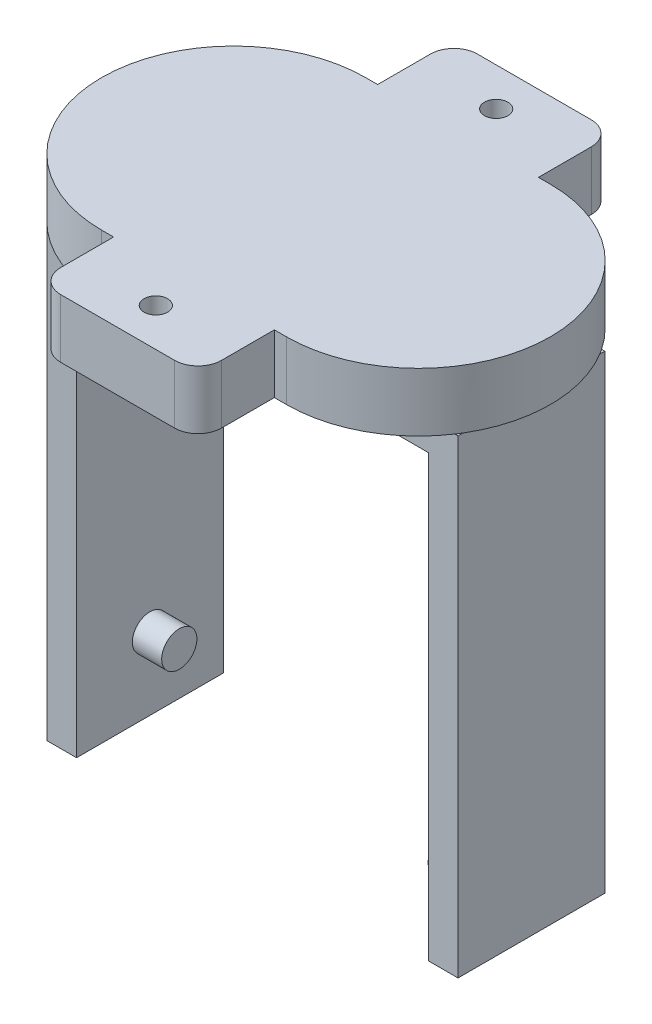
ISO-10303-21;
HEADER;
FILE_DESCRIPTION(('STEP AP214'),'2;1');
FILE_NAME('part.step','',(''),(''),'','','');
FILE_SCHEMA(('AUTOMOTIVE_DESIGN { 1 0 10303 214 1 1 1 1 }'));
ENDSEC;
DATA;
#1=APPLICATION_CONTEXT('core data for automotive mechanical design processes');
#2=APPLICATION_PROTOCOL_DEFINITION('international standard','automotive_design',2000,#1);
#3=PRODUCT_CONTEXT('',#1,'mechanical');
#4=PRODUCT('Part','Part','',(#3));
#5=PRODUCT_RELATED_PRODUCT_CATEGORY('part','',(#4));
#6=PRODUCT_DEFINITION_FORMATION('','',#4);
#7=PRODUCT_DEFINITION_CONTEXT('part definition',#1,'design');
#8=PRODUCT_DEFINITION('design','',#6,#7);
#9=PRODUCT_DEFINITION_SHAPE('','',#8);
#10=(LENGTH_UNIT() NAMED_UNIT(*) SI_UNIT(.MILLI.,.METRE.));
#11=(NAMED_UNIT(*) PLANE_ANGLE_UNIT() SI_UNIT($,.RADIAN.));
#12=(NAMED_UNIT(*) SI_UNIT($,.STERADIAN.) SOLID_ANGLE_UNIT());
#13=UNCERTAINTY_MEASURE_WITH_UNIT(LENGTH_MEASURE(1.E-05),#10,'distance_accuracy_value','');
#14=(GEOMETRIC_REPRESENTATION_CONTEXT(3) GLOBAL_UNCERTAINTY_ASSIGNED_CONTEXT((#13)) GLOBAL_UNIT_ASSIGNED_CONTEXT((#10,
#11,#12)) REPRESENTATION_CONTEXT('',''));
#15=CARTESIAN_POINT('',(0.,0.,0.));
#16=DIRECTION('',(0.,0.,1.));
#17=DIRECTION('',(1.,0.,0.));
#18=AXIS2_PLACEMENT_3D('',#15,#16,#17);
#19=CARTESIAN_POINT('',(5.,21.2431693989071,12.431693989071));
#20=DIRECTION('',(0.,-1.,0.));
#21=DIRECTION('',(0.,0.,-1.));
#22=AXIS2_PLACEMENT_3D('',#19,#20,#21);
#23=PLANE('',#22);
#24=CARTESIAN_POINT('',(19.25,21.2431693989071,-0.068306010928991));
#25=DIRECTION('',(0.,1.,0.));
#26=DIRECTION('',(0.,0.,1.));
#27=AXIS2_PLACEMENT_3D('',#24,#25,#26);
#28=CIRCLE('',#27,22.5);
#29=CARTESIAN_POINT('',(0.541713066130295,21.2431693989071,-12.568306010929));
#30=VERTEX_POINT('',#29);
#31=CARTESIAN_POINT('',(0.,21.2431693989071,-11.7168037681507));
#32=VERTEX_POINT('',#31);
#33=EDGE_CURVE('E11',#30,#32,#28,.T.);
#34=ORIENTED_EDGE('',*,*,#33,.F.);
#35=DIRECTION('',(-1.,0.,0.));
#36=VECTOR('',#35,1.);
#37=CARTESIAN_POINT('',(5.,21.2431693989071,-12.568306010929));
#38=LINE('',#37,#36);
#39=CARTESIAN_POINT('',(0.,21.2431693989071,-12.568306010929));
#40=VERTEX_POINT('',#39);
#41=EDGE_CURVE('E525',#30,#40,#38,.T.);
#42=ORIENTED_EDGE('',*,*,#41,.T.);
#43=DIRECTION('',(0.,0.,1.));
#44=VECTOR('',#43,1.);
#45=CARTESIAN_POINT('',(0.,21.2431693989071,12.431693989071));
#46=LINE('',#45,#44);
#47=EDGE_CURVE('E500',#40,#32,#46,.T.);
#48=ORIENTED_EDGE('',*,*,#47,.T.);
#49=EDGE_LOOP('',(#34,#42,#48));
#50=FACE_BOUND('',#49,.T.);
#51=ADVANCED_FACE('F43',(#50),#23,.F.);
#52=CARTESIAN_POINT('',(0.,21.2431693989071,11.5801917462927));
#53=VERTEX_POINT('',#52);
#54=CARTESIAN_POINT('',(0.541713066130302,21.2431693989071,12.431693989071));
#55=VERTEX_POINT('',#54);
#56=EDGE_CURVE('E53',#53,#55,#28,.T.);
#57=ORIENTED_EDGE('',*,*,#56,.F.);
#58=CARTESIAN_POINT('',(0.,21.2431693989071,12.431693989071));
#59=VERTEX_POINT('',#58);
#60=EDGE_CURVE('E517',#53,#59,#46,.T.);
#61=ORIENTED_EDGE('',*,*,#60,.T.);
#62=DIRECTION('',(-1.,0.,0.));
#63=VECTOR('',#62,1.);
#64=CARTESIAN_POINT('',(5.,21.2431693989071,12.431693989071));
#65=LINE('',#64,#63);
#66=EDGE_CURVE('E506',#55,#59,#65,.T.);
#67=ORIENTED_EDGE('',*,*,#66,.F.);
#68=EDGE_LOOP('',(#57,#61,#67));
#69=FACE_BOUND('',#68,.T.);
#70=ADVANCED_FACE('F596',(#69),#23,.F.);
#71=CARTESIAN_POINT('',(50.75,21.2431693989071,-0.068306010928991));
#72=DIRECTION('',(0.,1.,0.));
#73=DIRECTION('',(0.,0.,1.));
#74=AXIS2_PLACEMENT_3D('',#71,#72,#73);
#75=CIRCLE('',#74,22.5);
#76=CARTESIAN_POINT('',(69.4582869338697,21.2431693989071,12.431693989071));
#77=VERTEX_POINT('',#76);
#78=CARTESIAN_POINT('',(70.,21.2431693989071,11.5801917462927));
#79=VERTEX_POINT('',#78);
#80=EDGE_CURVE('E549',#77,#79,#75,.T.);
#81=ORIENTED_EDGE('',*,*,#80,.F.);
#82=CARTESIAN_POINT('',(70.,21.2431693989071,12.431693989071));
#83=VERTEX_POINT('',#82);
#84=EDGE_CURVE('E521',#83,#77,#65,.T.);
#85=ORIENTED_EDGE('',*,*,#84,.F.);
#86=DIRECTION('',(0.,0.,1.));
#87=VECTOR('',#86,1.);
#88=CARTESIAN_POINT('',(70.,21.2431693989071,12.431693989071));
#89=LINE('',#88,#87);
#90=EDGE_CURVE('E68',#79,#83,#89,.T.);
#91=ORIENTED_EDGE('',*,*,#90,.F.);
#92=EDGE_LOOP('',(#81,#85,#91));
#93=FACE_BOUND('',#92,.T.);
#94=ADVANCED_FACE('F630',(#93),#23,.F.);
#95=CARTESIAN_POINT('',(5.,21.2431693989071,12.431693989071));
#96=DIRECTION('',(0.,0.,-1.));
#97=DIRECTION('',(0.,1.,0.));
#98=AXIS2_PLACEMENT_3D('',#95,#96,#97);
#99=PLANE('',#98);
#100=DIRECTION('',(0.,-1.,0.));
#101=VECTOR('',#100,1.);
#102=CARTESIAN_POINT('',(0.,21.2431693989071,12.431693989071));
#103=LINE('',#102,#101);
#104=CARTESIAN_POINT('',(0.,-58.7568306010929,12.431693989071));
#105=VERTEX_POINT('',#104);
#106=EDGE_CURVE('E495',#59,#105,#103,.T.);
#107=ORIENTED_EDGE('',*,*,#106,.T.);
#108=DIRECTION('',(-1.,0.,0.));
#109=VECTOR('',#108,1.);
#110=CARTESIAN_POINT('',(5.,-58.7568306010929,12.431693989071));
#111=LINE('',#110,#109);
#112=CARTESIAN_POINT('',(5.,-58.7568306010929,12.431693989071));
#113=VERTEX_POINT('',#112);
#114=EDGE_CURVE('E535',#113,#105,#111,.T.);
#115=ORIENTED_EDGE('',*,*,#114,.F.);
#116=DIRECTION('',(0.,-1.,0.));
#117=VECTOR('',#116,1.);
#118=CARTESIAN_POINT('',(5.,21.2431693989071,12.431693989071));
#119=LINE('',#118,#117);
#120=CARTESIAN_POINT('',(5.,16.2431693989071,12.431693989071));
#121=VERTEX_POINT('',#120);
#122=EDGE_CURVE('E496',#121,#113,#119,.T.);
#123=ORIENTED_EDGE('',*,*,#122,.F.);
#124=DIRECTION('',(-1.,0.,0.));
#125=VECTOR('',#124,1.);
#126=CARTESIAN_POINT('',(65.,16.2431693989071,12.431693989071));
#127=LINE('',#126,#125);
#128=CARTESIAN_POINT('',(65.,16.2431693989071,12.431693989071));
#129=VERTEX_POINT('',#128);
#130=EDGE_CURVE('E491',#129,#121,#127,.T.);
#131=ORIENTED_EDGE('',*,*,#130,.F.);
#132=DIRECTION('',(0.,-1.,0.));
#133=VECTOR('',#132,1.);
#134=CARTESIAN_POINT('',(65.,21.2431693989071,12.431693989071));
#135=LINE('',#134,#133);
#136=CARTESIAN_POINT('',(65.,-58.7568306010929,12.431693989071));
#137=VERTEX_POINT('',#136);
#138=EDGE_CURVE('E445',#129,#137,#135,.T.);
#139=ORIENTED_EDGE('',*,*,#138,.T.);
#140=DIRECTION('',(-1.,0.,0.));
#141=VECTOR('',#140,1.);
#142=CARTESIAN_POINT('',(70.,-58.7568306010929,12.431693989071));
#143=LINE('',#142,#141);
#144=CARTESIAN_POINT('',(70.,-58.7568306010929,12.431693989071));
#145=VERTEX_POINT('',#144);
#146=EDGE_CURVE('E475',#145,#137,#143,.T.);
#147=ORIENTED_EDGE('',*,*,#146,.F.);
#148=DIRECTION('',(0.,-1.,0.));
#149=VECTOR('',#148,1.);
#150=CARTESIAN_POINT('',(70.,21.2431693989071,12.431693989071));
#151=LINE('',#150,#149);
#152=EDGE_CURVE('E446',#83,#145,#151,.T.);
#153=ORIENTED_EDGE('',*,*,#152,.F.);
#154=ORIENTED_EDGE('',*,*,#84,.T.);
#155=EDGE_CURVE('E526',#77,#55,#65,.T.);
#156=ORIENTED_EDGE('',*,*,#155,.T.);
#157=ORIENTED_EDGE('',*,*,#66,.T.);
#158=EDGE_LOOP('',(#107,#115,#123,#131,#139,#147,#153,#154,#156,#157));
#159=FACE_BOUND('',#158,.T.);
#160=ADVANCED_FACE('F45',(#159),#99,.F.);
#161=CARTESIAN_POINT('',(5.,-58.7568306010929,12.431693989071));
#162=DIRECTION('',(0.,1.,0.));
#163=DIRECTION('',(0.,0.,1.));
#164=AXIS2_PLACEMENT_3D('',#161,#162,#163);
#165=PLANE('',#164);
#166=DIRECTION('',(0.,0.,-1.));
#167=VECTOR('',#166,1.);
#168=CARTESIAN_POINT('',(0.,-58.7568306010929,12.431693989071));
#169=LINE('',#168,#167);
#170=CARTESIAN_POINT('',(0.,-58.7568306010929,-12.568306010929));
#171=VERTEX_POINT('',#170);
#172=EDGE_CURVE('E510',#105,#171,#169,.T.);
#173=ORIENTED_EDGE('',*,*,#172,.T.);
#174=DIRECTION('',(-1.,0.,0.));
#175=VECTOR('',#174,1.);
#176=CARTESIAN_POINT('',(5.,-58.7568306010929,-12.568306010929));
#177=LINE('',#176,#175);
#178=CARTESIAN_POINT('',(5.,-58.7568306010929,-12.568306010929));
#179=VERTEX_POINT('',#178);
#180=EDGE_CURVE('E530',#179,#171,#177,.T.);
#181=ORIENTED_EDGE('',*,*,#180,.F.);
#182=DIRECTION('',(0.,0.,-1.));
#183=VECTOR('',#182,1.);
#184=CARTESIAN_POINT('',(5.,-58.7568306010929,12.431693989071));
#185=LINE('',#184,#183);
#186=EDGE_CURVE('E499',#113,#179,#185,.T.);
#187=ORIENTED_EDGE('',*,*,#186,.F.);
#188=ORIENTED_EDGE('',*,*,#114,.T.);
#189=EDGE_LOOP('',(#173,#181,#187,#188));
#190=FACE_BOUND('',#189,.T.);
#191=ADVANCED_FACE('F606',(#190),#165,.F.);
#192=CARTESIAN_POINT('',(5.,21.2431693989071,-12.568306010929));
#193=DIRECTION('',(0.,0.,1.));
#194=DIRECTION('',(0.,-1.,0.));
#195=AXIS2_PLACEMENT_3D('',#192,#193,#194);
#196=PLANE('',#195);
#197=DIRECTION('',(0.,1.,0.));
#198=VECTOR('',#197,1.);
#199=CARTESIAN_POINT('',(0.,21.2431693989071,-12.568306010929));
#200=LINE('',#199,#198);
#201=EDGE_CURVE('E513',#171,#40,#200,.T.);
#202=ORIENTED_EDGE('',*,*,#201,.T.);
#203=ORIENTED_EDGE('',*,*,#41,.F.);
#204=CARTESIAN_POINT('',(69.4582869338697,21.2431693989071,-12.568306010929));
#205=VERTEX_POINT('',#204);
#206=EDGE_CURVE('E531',#205,#30,#38,.T.);
#207=ORIENTED_EDGE('',*,*,#206,.F.);
#208=CARTESIAN_POINT('',(70.,21.2431693989071,-12.568306010929));
#209=VERTEX_POINT('',#208);
#210=EDGE_CURVE('E527',#209,#205,#38,.T.);
#211=ORIENTED_EDGE('',*,*,#210,.F.);
#212=DIRECTION('',(0.,1.,0.));
#213=VECTOR('',#212,1.);
#214=CARTESIAN_POINT('',(70.,21.2431693989071,-12.568306010929));
#215=LINE('',#214,#213);
#216=CARTESIAN_POINT('',(70.,-58.7568306010929,-12.568306010929));
#217=VERTEX_POINT('',#216);
#218=EDGE_CURVE('E454',#217,#209,#215,.T.);
#219=ORIENTED_EDGE('',*,*,#218,.F.);
#220=DIRECTION('',(-1.,0.,0.));
#221=VECTOR('',#220,1.);
#222=CARTESIAN_POINT('',(70.,-58.7568306010929,-12.568306010929));
#223=LINE('',#222,#221);
#224=CARTESIAN_POINT('',(65.,-58.7568306010929,-12.568306010929));
#225=VERTEX_POINT('',#224);
#226=EDGE_CURVE('E462',#217,#225,#223,.T.);
#227=ORIENTED_EDGE('',*,*,#226,.T.);
#228=DIRECTION('',(0.,1.,0.));
#229=VECTOR('',#228,1.);
#230=CARTESIAN_POINT('',(65.,21.2431693989071,-12.568306010929));
#231=LINE('',#230,#229);
#232=CARTESIAN_POINT('',(65.,16.2431693989071,-12.568306010929));
#233=VERTEX_POINT('',#232);
#234=EDGE_CURVE('E451',#225,#233,#231,.T.);
#235=ORIENTED_EDGE('',*,*,#234,.T.);
#236=DIRECTION('',(-1.,0.,0.));
#237=VECTOR('',#236,1.);
#238=CARTESIAN_POINT('',(65.,16.2431693989071,-12.568306010929));
#239=LINE('',#238,#237);
#240=CARTESIAN_POINT('',(5.,16.2431693989071,-12.568306010929));
#241=VERTEX_POINT('',#240);
#242=EDGE_CURVE('E484',#233,#241,#239,.T.);
#243=ORIENTED_EDGE('',*,*,#242,.T.);
#244=DIRECTION('',(0.,1.,0.));
#245=VECTOR('',#244,1.);
#246=CARTESIAN_POINT('',(5.,21.2431693989071,-12.568306010929));
#247=LINE('',#246,#245);
#248=EDGE_CURVE('E503',#179,#241,#247,.T.);
#249=ORIENTED_EDGE('',*,*,#248,.F.);
#250=ORIENTED_EDGE('',*,*,#180,.T.);
#251=EDGE_LOOP('',(#202,#203,#207,#211,#219,#227,#235,#243,#249,#250));
#252=FACE_BOUND('',#251,.T.);
#253=ADVANCED_FACE('F618',(#252),#196,.F.);
#254=CARTESIAN_POINT('',(70.,21.2431693989071,-11.7168037681507));
#255=VERTEX_POINT('',#254);
#256=EDGE_CURVE('E327',#255,#205,#75,.T.);
#257=ORIENTED_EDGE('',*,*,#256,.F.);
#258=EDGE_CURVE('E458',#209,#255,#89,.T.);
#259=ORIENTED_EDGE('',*,*,#258,.F.);
#260=ORIENTED_EDGE('',*,*,#210,.T.);
#261=EDGE_LOOP('',(#257,#259,#260));
#262=FACE_BOUND('',#261,.T.);
#263=ADVANCED_FACE('F633',(#262),#23,.F.);
#264=CARTESIAN_POINT('',(5.,0.,0.));
#265=DIRECTION('',(1.,0.,0.));
#266=DIRECTION('',(0.,0.,-1.));
#267=AXIS2_PLACEMENT_3D('',#264,#265,#266);
#268=PLANE('',#267);
#269=CARTESIAN_POINT('',(5.,-46.4568306010929,-0.0683060109289979));
#270=DIRECTION('',(1.,0.,0.));
#271=DIRECTION('',(0.,0.,-1.));
#272=AXIS2_PLACEMENT_3D('',#269,#270,#271);
#273=CIRCLE('',#272,3.);
#274=CARTESIAN_POINT('',(5.,-46.4568306010929,-3.068306010929));
#275=VERTEX_POINT('',#274);
#276=EDGE_CURVE('E243',#275,#275,#273,.T.);
#277=ORIENTED_EDGE('',*,*,#276,.F.);
#278=EDGE_LOOP('',(#277));
#279=FACE_BOUND('',#278,.T.);
#280=DIRECTION('',(0.,0.,-1.));
#281=VECTOR('',#280,1.);
#282=CARTESIAN_POINT('',(5.,16.2431693989071,12.431693989071));
#283=LINE('',#282,#281);
#284=EDGE_CURVE('E479',#121,#241,#283,.T.);
#285=ORIENTED_EDGE('',*,*,#284,.F.);
#286=ORIENTED_EDGE('',*,*,#122,.T.);
#287=ORIENTED_EDGE('',*,*,#186,.T.);
#288=ORIENTED_EDGE('',*,*,#248,.T.);
#289=EDGE_LOOP('',(#285,#286,#287,#288));
#290=FACE_BOUND('',#289,.T.);
#291=ADVANCED_FACE('F641',(#279,#290),#268,.T.);
#292=CARTESIAN_POINT('',(0.,0.,0.));
#293=DIRECTION('',(1.,0.,0.));
#294=DIRECTION('',(0.,0.,-1.));
#295=AXIS2_PLACEMENT_3D('',#292,#293,#294);
#296=PLANE('',#295);
#297=ORIENTED_EDGE('',*,*,#106,.F.);
#298=ORIENTED_EDGE('',*,*,#60,.F.);
#299=EDGE_CURVE('E520',#32,#53,#46,.T.);
#300=ORIENTED_EDGE('',*,*,#299,.F.);
#301=ORIENTED_EDGE('',*,*,#47,.F.);
#302=ORIENTED_EDGE('',*,*,#201,.F.);
#303=ORIENTED_EDGE('',*,*,#172,.F.);
#304=EDGE_LOOP('',(#297,#298,#300,#301,#302,#303));
#305=FACE_BOUND('',#304,.T.);
#306=ADVANCED_FACE('F600',(#305),#296,.F.);
#307=CARTESIAN_POINT('',(65.,16.2431693989071,12.431693989071));
#308=DIRECTION('',(0.,1.,0.));
#309=DIRECTION('',(0.,0.,1.));
#310=AXIS2_PLACEMENT_3D('',#307,#308,#309);
#311=PLANE('',#310);
#312=ORIENTED_EDGE('',*,*,#284,.T.);
#313=ORIENTED_EDGE('',*,*,#242,.F.);
#314=DIRECTION('',(0.,0.,-1.));
#315=VECTOR('',#314,1.);
#316=CARTESIAN_POINT('',(65.,16.2431693989071,12.431693989071));
#317=LINE('',#316,#315);
#318=EDGE_CURVE('E480',#129,#233,#317,.T.);
#319=ORIENTED_EDGE('',*,*,#318,.F.);
#320=ORIENTED_EDGE('',*,*,#130,.T.);
#321=EDGE_LOOP('',(#312,#313,#319,#320));
#322=FACE_BOUND('',#321,.T.);
#323=ADVANCED_FACE('F612',(#322),#311,.F.);
#324=CARTESIAN_POINT('',(65.,0.,0.));
#325=DIRECTION('',(1.,0.,0.));
#326=DIRECTION('',(0.,0.,-1.));
#327=AXIS2_PLACEMENT_3D('',#324,#325,#326);
#328=PLANE('',#327);
#329=CARTESIAN_POINT('',(65.,-46.4568306010929,-0.0683060109289875));
#330=DIRECTION('',(1.,0.,0.));
#331=DIRECTION('',(0.,0.,-1.));
#332=AXIS2_PLACEMENT_3D('',#329,#330,#331);
#333=CIRCLE('',#332,10.3);
#334=CARTESIAN_POINT('',(65.,-46.4568306010929,-10.368306010929));
#335=VERTEX_POINT('',#334);
#336=EDGE_CURVE('E538',#335,#335,#333,.F.);
#337=ORIENTED_EDGE('',*,*,#336,.F.);
#338=EDGE_LOOP('',(#337));
#339=FACE_BOUND('',#338,.T.);
#340=ORIENTED_EDGE('',*,*,#138,.F.);
#341=ORIENTED_EDGE('',*,*,#318,.T.);
#342=ORIENTED_EDGE('',*,*,#234,.F.);
#343=DIRECTION('',(0.,0.,-1.));
#344=VECTOR('',#343,1.);
#345=CARTESIAN_POINT('',(65.,-58.7568306010929,12.431693989071));
#346=LINE('',#345,#344);
#347=EDGE_CURVE('E466',#137,#225,#346,.T.);
#348=ORIENTED_EDGE('',*,*,#347,.F.);
#349=EDGE_LOOP('',(#340,#341,#342,#348));
#350=FACE_BOUND('',#349,.T.);
#351=ADVANCED_FACE('F615',(#339,#350),#328,.F.);
#352=CARTESIAN_POINT('',(70.,-58.7568306010929,12.431693989071));
#353=DIRECTION('',(0.,1.,0.));
#354=DIRECTION('',(0.,0.,1.));
#355=AXIS2_PLACEMENT_3D('',#352,#353,#354);
#356=PLANE('',#355);
#357=ORIENTED_EDGE('',*,*,#347,.T.);
#358=ORIENTED_EDGE('',*,*,#226,.F.);
#359=DIRECTION('',(0.,0.,-1.));
#360=VECTOR('',#359,1.);
#361=CARTESIAN_POINT('',(70.,-58.7568306010929,12.431693989071));
#362=LINE('',#361,#360);
#363=EDGE_CURVE('E450',#145,#217,#362,.T.);
#364=ORIENTED_EDGE('',*,*,#363,.F.);
#365=ORIENTED_EDGE('',*,*,#146,.T.);
#366=EDGE_LOOP('',(#357,#358,#364,#365));
#367=FACE_BOUND('',#366,.T.);
#368=ADVANCED_FACE('F623',(#367),#356,.F.);
#369=CARTESIAN_POINT('',(70.,0.,0.));
#370=DIRECTION('',(1.,0.,0.));
#371=DIRECTION('',(0.,0.,-1.));
#372=AXIS2_PLACEMENT_3D('',#369,#370,#371);
#373=PLANE('',#372);
#374=ORIENTED_EDGE('',*,*,#152,.T.);
#375=ORIENTED_EDGE('',*,*,#363,.T.);
#376=ORIENTED_EDGE('',*,*,#218,.T.);
#377=ORIENTED_EDGE('',*,*,#258,.T.);
#378=EDGE_CURVE('E463',#255,#79,#89,.T.);
#379=ORIENTED_EDGE('',*,*,#378,.T.);
#380=ORIENTED_EDGE('',*,*,#90,.T.);
#381=EDGE_LOOP('',(#374,#375,#376,#377,#379,#380));
#382=FACE_BOUND('',#381,.T.);
#383=ADVANCED_FACE('F627',(#382),#373,.T.);
#384=CARTESIAN_POINT('',(62.7,-46.4568306010929,-0.0683060109289875));
#385=DIRECTION('',(1.,0.,0.));
#386=DIRECTION('',(0.,0.,-1.));
#387=AXIS2_PLACEMENT_3D('',#384,#385,#386);
#388=CYLINDRICAL_SURFACE('',#387,10.3);
#389=CARTESIAN_POINT('',(62.7,-46.4568306010929,-0.0683060109289875));
#390=DIRECTION('',(-1.,0.,0.));
#391=DIRECTION('',(0.,0.,1.));
#392=AXIS2_PLACEMENT_3D('',#389,#390,#391);
#393=CIRCLE('',#392,10.3);
#394=CARTESIAN_POINT('',(62.7,-46.4568306010929,10.231693989071));
#395=VERTEX_POINT('',#394);
#396=EDGE_CURVE('E438',#395,#395,#393,.T.);
#397=ORIENTED_EDGE('',*,*,#396,.F.);
#398=EDGE_LOOP('',(#397));
#399=FACE_BOUND('',#398,.T.);
#400=ORIENTED_EDGE('',*,*,#336,.T.);
#401=EDGE_LOOP('',(#400));
#402=FACE_BOUND('',#401,.T.);
#403=ADVANCED_FACE('F703',(#399,#402),#388,.T.);
#404=CARTESIAN_POINT('',(62.7,-46.4568306010929,-0.0683060109289875));
#405=DIRECTION('',(-1.,0.,0.));
#406=DIRECTION('',(0.,0.,1.));
#407=AXIS2_PLACEMENT_3D('',#404,#405,#406);
#408=PLANE('',#407);
#409=CARTESIAN_POINT('',(62.7,-46.4568306010929,-0.0683060109289875));
#410=DIRECTION('',(-1.,0.,0.));
#411=DIRECTION('',(0.,0.,1.));
#412=AXIS2_PLACEMENT_3D('',#409,#410,#411);
#413=CIRCLE('',#412,4.35);
#414=CARTESIAN_POINT('',(62.7,-46.4568306010929,4.28169398907101));
#415=VERTEX_POINT('',#414);
#416=EDGE_CURVE('E433',#415,#415,#413,.T.);
#417=ORIENTED_EDGE('',*,*,#416,.F.);
#418=EDGE_LOOP('',(#417));
#419=FACE_BOUND('',#418,.T.);
#420=ORIENTED_EDGE('',*,*,#396,.T.);
#421=EDGE_LOOP('',(#420));
#422=FACE_BOUND('',#421,.T.);
#423=ADVANCED_FACE('F967',(#419,#422),#408,.T.);
#424=CARTESIAN_POINT('',(59.55,-46.4568306010929,-0.0683060109289875));
#425=DIRECTION('',(-1.,0.,0.));
#426=DIRECTION('',(0.,0.,1.));
#427=AXIS2_PLACEMENT_3D('',#424,#425,#426);
#428=PLANE('',#427);
#429=CARTESIAN_POINT('',(59.55,-46.4568306010929,-0.0683060109289875));
#430=DIRECTION('',(-1.,0.,0.));
#431=DIRECTION('',(0.,0.,1.));
#432=AXIS2_PLACEMENT_3D('',#429,#430,#431);
#433=CIRCLE('',#432,4.35);
#434=CARTESIAN_POINT('',(59.55,-46.4568306010929,4.28169398907101));
#435=VERTEX_POINT('',#434);
#436=EDGE_CURVE('E434',#435,#435,#433,.T.);
#437=ORIENTED_EDGE('',*,*,#436,.T.);
#438=EDGE_LOOP('',(#437));
#439=FACE_BOUND('',#438,.T.);
#440=CARTESIAN_POINT('',(59.55,-46.4568306010929,-0.0683060109289875));
#441=DIRECTION('',(-1.,0.,0.));
#442=DIRECTION('',(0.,0.,1.));
#443=AXIS2_PLACEMENT_3D('',#440,#441,#442);
#444=CIRCLE('',#443,3.);
#445=CARTESIAN_POINT('',(59.55,-46.4568306010929,2.93169398907101));
#446=VERTEX_POINT('',#445);
#447=EDGE_CURVE('E426',#446,#446,#444,.T.);
#448=ORIENTED_EDGE('',*,*,#447,.F.);
#449=EDGE_LOOP('',(#448));
#450=FACE_BOUND('',#449,.T.);
#451=ADVANCED_FACE('F964',(#439,#450),#428,.T.);
#452=CARTESIAN_POINT('',(59.55,-46.4568306010929,-0.0683060109289875));
#453=DIRECTION('',(1.,0.,0.));
#454=DIRECTION('',(0.,0.,-1.));
#455=AXIS2_PLACEMENT_3D('',#452,#453,#454);
#456=CYLINDRICAL_SURFACE('',#455,4.35);
#457=ORIENTED_EDGE('',*,*,#436,.F.);
#458=EDGE_LOOP('',(#457));
#459=FACE_BOUND('',#458,.T.);
#460=ORIENTED_EDGE('',*,*,#416,.T.);
#461=EDGE_LOOP('',(#460));
#462=FACE_BOUND('',#461,.T.);
#463=ADVANCED_FACE('F962',(#459,#462),#456,.T.);
#464=CARTESIAN_POINT('',(59.55,-46.4568306010929,-0.0683060109289875));
#465=DIRECTION('',(1.,0.,0.));
#466=DIRECTION('',(0.,0.,-1.));
#467=AXIS2_PLACEMENT_3D('',#464,#465,#466);
#468=CYLINDRICAL_SURFACE('',#467,3.);
#469=ORIENTED_EDGE('',*,*,#447,.T.);
#470=EDGE_LOOP('',(#469));
#471=FACE_BOUND('',#470,.T.);
#472=CARTESIAN_POINT('',(62.7,-46.4568306010929,-0.0683060109289875));
#473=DIRECTION('',(-1.,0.,0.));
#474=DIRECTION('',(0.,0.,1.));
#475=AXIS2_PLACEMENT_3D('',#472,#473,#474);
#476=CIRCLE('',#475,3.);
#477=CARTESIAN_POINT('',(62.7,-46.4568306010929,2.93169398907101));
#478=VERTEX_POINT('',#477);
#479=EDGE_CURVE('E47',#478,#478,#476,.F.);
#480=ORIENTED_EDGE('',*,*,#479,.T.);
#481=EDGE_LOOP('',(#480));
#482=FACE_BOUND('',#481,.T.);
#483=ADVANCED_FACE('F959',(#471,#482),#468,.F.);
#484=ORIENTED_EDGE('',*,*,#479,.F.);
#485=EDGE_LOOP('',(#484));
#486=FACE_BOUND('',#485,.T.);
#487=ADVANCED_FACE('F957',(#486),#408,.T.);
#488=CARTESIAN_POINT('',(10.,-46.4568306010929,-0.0683060109289979));
#489=DIRECTION('',(-1.,0.,0.));
#490=DIRECTION('',(0.,0.,1.));
#491=AXIS2_PLACEMENT_3D('',#488,#489,#490);
#492=CYLINDRICAL_SURFACE('',#491,3.);
#493=CARTESIAN_POINT('',(10.,-46.4568306010929,-0.0683060109289979));
#494=DIRECTION('',(1.,0.,0.));
#495=DIRECTION('',(0.,0.,-1.));
#496=AXIS2_PLACEMENT_3D('',#493,#494,#495);
#497=CIRCLE('',#496,3.);
#498=CARTESIAN_POINT('',(10.,-46.4568306010929,-3.068306010929));
#499=VERTEX_POINT('',#498);
#500=EDGE_CURVE('E422',#499,#499,#497,.T.);
#501=ORIENTED_EDGE('',*,*,#500,.F.);
#502=EDGE_LOOP('',(#501));
#503=FACE_BOUND('',#502,.T.);
#504=ORIENTED_EDGE('',*,*,#276,.T.);
#505=EDGE_LOOP('',(#504));
#506=FACE_BOUND('',#505,.T.);
#507=ADVANCED_FACE('F953',(#503,#506),#492,.T.);
#508=CARTESIAN_POINT('',(10.,-46.4568306010929,-0.0683060109289979));
#509=DIRECTION('',(1.,0.,0.));
#510=DIRECTION('',(0.,0.,-1.));
#511=AXIS2_PLACEMENT_3D('',#508,#509,#510);
#512=PLANE('',#511);
#513=ORIENTED_EDGE('',*,*,#500,.T.);
#514=EDGE_LOOP('',(#513));
#515=FACE_BOUND('',#514,.T.);
#516=ADVANCED_FACE('F717',(#515),#512,.T.);
#517=CARTESIAN_POINT('',(0.,21.2431693989071,0.));
#518=DIRECTION('',(0.,1.,0.));
#519=DIRECTION('',(0.,0.,1.));
#520=AXIS2_PLACEMENT_3D('',#517,#518,#519);
#521=PLANE('',#520);
#522=EDGE_CURVE('E55',#32,#53,#28,.T.);
#523=ORIENTED_EDGE('',*,*,#522,.F.);
#524=ORIENTED_EDGE('',*,*,#299,.T.);
#525=EDGE_LOOP('',(#523,#524));
#526=FACE_BOUND('',#525,.T.);
#527=ADVANCED_FACE('F712',(#526),#521,.F.);
#528=ORIENTED_EDGE('',*,*,#155,.F.);
#529=CARTESIAN_POINT('',(50.75,21.2431693989071,22.431693989071));
#530=VERTEX_POINT('',#529);
#531=EDGE_CURVE('E321',#530,#77,#75,.T.);
#532=ORIENTED_EDGE('',*,*,#531,.F.);
#533=DIRECTION('',(1.,0.,0.));
#534=VECTOR('',#533,1.);
#535=CARTESIAN_POINT('',(0.,21.2431693989071,22.431693989071));
#536=LINE('',#535,#534);
#537=CARTESIAN_POINT('',(48.7,21.2431693989071,22.431693989071));
#538=VERTEX_POINT('',#537);
#539=EDGE_CURVE('E316',#538,#530,#536,.T.);
#540=ORIENTED_EDGE('',*,*,#539,.F.);
#541=DIRECTION('',(0.,0.,1.));
#542=VECTOR('',#541,1.);
#543=CARTESIAN_POINT('',(48.7,21.2431693989071,0.));
#544=LINE('',#543,#542);
#545=CARTESIAN_POINT('',(48.7,21.2431693989071,31.431693989071));
#546=VERTEX_POINT('',#545);
#547=EDGE_CURVE('E313',#538,#546,#544,.T.);
#548=ORIENTED_EDGE('',*,*,#547,.T.);
#549=CARTESIAN_POINT('',(44.7,21.2431693989071,31.431693989071));
#550=DIRECTION('',(0.,1.,0.));
#551=DIRECTION('',(0.,0.,1.));
#552=AXIS2_PLACEMENT_3D('',#549,#550,#551);
#553=CIRCLE('',#552,4.);
#554=CARTESIAN_POINT('',(44.7,21.2431693989071,35.431693989071));
#555=VERTEX_POINT('',#554);
#556=EDGE_CURVE('E237',#546,#555,#553,.F.);
#557=ORIENTED_EDGE('',*,*,#556,.T.);
#558=DIRECTION('',(-1.,0.,0.));
#559=VECTOR('',#558,1.);
#560=CARTESIAN_POINT('',(0.,21.2431693989071,35.431693989071));
#561=LINE('',#560,#559);
#562=CARTESIAN_POINT('',(25.3,21.2431693989071,35.431693989071));
#563=VERTEX_POINT('',#562);
#564=EDGE_CURVE('E363',#555,#563,#561,.T.);
#565=ORIENTED_EDGE('',*,*,#564,.T.);
#566=CARTESIAN_POINT('',(25.3,21.2431693989071,31.431693989071));
#567=DIRECTION('',(0.,1.,0.));
#568=DIRECTION('',(0.,0.,1.));
#569=AXIS2_PLACEMENT_3D('',#566,#567,#568);
#570=CIRCLE('',#569,4.);
#571=CARTESIAN_POINT('',(21.3,21.2431693989071,31.431693989071));
#572=VERTEX_POINT('',#571);
#573=EDGE_CURVE('E359',#572,#563,#570,.T.);
#574=ORIENTED_EDGE('',*,*,#573,.F.);
#575=DIRECTION('',(0.,0.,1.));
#576=VECTOR('',#575,1.);
#577=CARTESIAN_POINT('',(21.3,21.2431693989071,0.));
#578=LINE('',#577,#576);
#579=CARTESIAN_POINT('',(21.3,21.2431693989071,22.431693989071));
#580=VERTEX_POINT('',#579);
#581=EDGE_CURVE('E356',#580,#572,#578,.T.);
#582=ORIENTED_EDGE('',*,*,#581,.F.);
#583=CARTESIAN_POINT('',(19.25,21.2431693989071,22.431693989071));
#584=VERTEX_POINT('',#583);
#585=EDGE_CURVE('E320',#584,#580,#536,.T.);
#586=ORIENTED_EDGE('',*,*,#585,.F.);
#587=EDGE_CURVE('E355',#55,#584,#28,.T.);
#588=ORIENTED_EDGE('',*,*,#587,.F.);
#589=EDGE_LOOP('',(#528,#532,#540,#548,#557,#565,#574,#582,#586,#588));
#590=FACE_BOUND('',#589,.T.);
#591=CARTESIAN_POINT('',(35.,21.2431693989071,28.931693989071));
#592=DIRECTION('',(0.,1.,0.));
#593=DIRECTION('',(0.,0.,1.));
#594=AXIS2_PLACEMENT_3D('',#591,#592,#593);
#595=CIRCLE('',#594,2.);
#596=CARTESIAN_POINT('',(35.,21.2431693989071,30.931693989071));
#597=VERTEX_POINT('',#596);
#598=EDGE_CURVE('E367',#597,#597,#595,.T.);
#599=ORIENTED_EDGE('',*,*,#598,.T.);
#600=EDGE_LOOP('',(#599));
#601=FACE_BOUND('',#600,.T.);
#602=ADVANCED_FACE('F583',(#590,#601),#521,.F.);
#603=CARTESIAN_POINT('',(35.,21.2431693989071,-29.068306010929));
#604=DIRECTION('',(0.,1.,0.));
#605=DIRECTION('',(0.,0.,1.));
#606=AXIS2_PLACEMENT_3D('',#603,#604,#605);
#607=CIRCLE('',#606,2.);
#608=CARTESIAN_POINT('',(35.,21.2431693989071,-27.068306010929));
#609=VERTEX_POINT('',#608);
#610=EDGE_CURVE('E254',#609,#609,#607,.T.);
#611=ORIENTED_EDGE('',*,*,#610,.T.);
#612=EDGE_LOOP('',(#611));
#613=FACE_BOUND('',#612,.T.);
#614=CARTESIAN_POINT('',(50.75,21.2431693989071,-22.568306010929));
#615=VERTEX_POINT('',#614);
#616=EDGE_CURVE('E319',#205,#615,#75,.T.);
#617=ORIENTED_EDGE('',*,*,#616,.F.);
#618=ORIENTED_EDGE('',*,*,#206,.T.);
#619=CARTESIAN_POINT('',(19.25,21.2431693989071,-22.568306010929));
#620=VERTEX_POINT('',#619);
#621=EDGE_CURVE('E351',#620,#30,#28,.T.);
#622=ORIENTED_EDGE('',*,*,#621,.F.);
#623=DIRECTION('',(1.,0.,0.));
#624=VECTOR('',#623,1.);
#625=CARTESIAN_POINT('',(0.,21.2431693989071,-22.568306010929));
#626=LINE('',#625,#624);
#627=CARTESIAN_POINT('',(21.3,21.2431693989071,-22.568306010929));
#628=VERTEX_POINT('',#627);
#629=EDGE_CURVE('E332',#620,#628,#626,.T.);
#630=ORIENTED_EDGE('',*,*,#629,.T.);
#631=DIRECTION('',(0.,0.,-1.));
#632=VECTOR('',#631,1.);
#633=CARTESIAN_POINT('',(21.3,21.2431693989071,0.));
#634=LINE('',#633,#632);
#635=CARTESIAN_POINT('',(21.3,21.2431693989071,-31.568306010929));
#636=VERTEX_POINT('',#635);
#637=EDGE_CURVE('E348',#628,#636,#634,.T.);
#638=ORIENTED_EDGE('',*,*,#637,.T.);
#639=CARTESIAN_POINT('',(25.3,21.2431693989071,-31.568306010929));
#640=DIRECTION('',(0.,1.,0.));
#641=DIRECTION('',(0.,0.,1.));
#642=AXIS2_PLACEMENT_3D('',#639,#640,#641);
#643=CIRCLE('',#642,4.);
#644=CARTESIAN_POINT('',(25.3,21.2431693989071,-35.568306010929));
#645=VERTEX_POINT('',#644);
#646=EDGE_CURVE('E344',#645,#636,#643,.T.);
#647=ORIENTED_EDGE('',*,*,#646,.F.);
#648=DIRECTION('',(1.,0.,0.));
#649=VECTOR('',#648,1.);
#650=CARTESIAN_POINT('',(0.,21.2431693989071,-35.568306010929));
#651=LINE('',#650,#649);
#652=CARTESIAN_POINT('',(44.7,21.2431693989071,-35.568306010929));
#653=VERTEX_POINT('',#652);
#654=EDGE_CURVE('E340',#645,#653,#651,.T.);
#655=ORIENTED_EDGE('',*,*,#654,.T.);
#656=CARTESIAN_POINT('',(44.7,21.2431693989071,-31.568306010929));
#657=DIRECTION('',(0.,1.,0.));
#658=DIRECTION('',(0.,0.,1.));
#659=AXIS2_PLACEMENT_3D('',#656,#657,#658);
#660=CIRCLE('',#659,4.);
#661=CARTESIAN_POINT('',(48.7,21.2431693989071,-31.568306010929));
#662=VERTEX_POINT('',#661);
#663=EDGE_CURVE('E336',#653,#662,#660,.F.);
#664=ORIENTED_EDGE('',*,*,#663,.T.);
#665=DIRECTION('',(0.,0.,-1.));
#666=VECTOR('',#665,1.);
#667=CARTESIAN_POINT('',(48.7,21.2431693989071,0.));
#668=LINE('',#667,#666);
#669=CARTESIAN_POINT('',(48.7,21.2431693989071,-22.568306010929));
#670=VERTEX_POINT('',#669);
#671=EDGE_CURVE('E331',#670,#662,#668,.T.);
#672=ORIENTED_EDGE('',*,*,#671,.F.);
#673=EDGE_CURVE('E325',#670,#615,#626,.T.);
#674=ORIENTED_EDGE('',*,*,#673,.T.);
#675=EDGE_LOOP('',(#617,#618,#622,#630,#638,#647,#655,#664,#672,#674));
#676=FACE_BOUND('',#675,.T.);
#677=ADVANCED_FACE('F570',(#613,#676),#521,.F.);
#678=CARTESIAN_POINT('',(44.7,31.2431693989071,31.431693989071));
#679=DIRECTION('',(0.,-1.,0.));
#680=DIRECTION('',(0.,0.,-1.));
#681=AXIS2_PLACEMENT_3D('',#678,#679,#680);
#682=CYLINDRICAL_SURFACE('',#681,4.);
#683=ORIENTED_EDGE('',*,*,#556,.F.);
#684=DIRECTION('',(0.,-1.,0.));
#685=VECTOR('',#684,1.);
#686=CARTESIAN_POINT('',(48.7,31.2431693989071,31.431693989071));
#687=LINE('',#686,#685);
#688=CARTESIAN_POINT('',(48.7,31.2431693989071,31.431693989071));
#689=VERTEX_POINT('',#688);
#690=EDGE_CURVE('E231',#689,#546,#687,.T.);
#691=ORIENTED_EDGE('',*,*,#690,.F.);
#692=CARTESIAN_POINT('',(44.7,31.2431693989071,31.431693989071));
#693=DIRECTION('',(0.,1.,0.));
#694=DIRECTION('',(0.,0.,1.));
#695=AXIS2_PLACEMENT_3D('',#692,#693,#694);
#696=CIRCLE('',#695,4.);
#697=CARTESIAN_POINT('',(44.7,31.2431693989071,35.431693989071));
#698=VERTEX_POINT('',#697);
#699=EDGE_CURVE('E234',#689,#698,#696,.F.);
#700=ORIENTED_EDGE('',*,*,#699,.T.);
#701=DIRECTION('',(0.,-1.,0.));
#702=VECTOR('',#701,1.);
#703=CARTESIAN_POINT('',(44.7,31.2431693989071,35.431693989071));
#704=LINE('',#703,#702);
#705=EDGE_CURVE('E310',#698,#555,#704,.T.);
#706=ORIENTED_EDGE('',*,*,#705,.T.);
#707=EDGE_LOOP('',(#683,#691,#700,#706));
#708=FACE_BOUND('',#707,.T.);
#709=ADVANCED_FACE('F233',(#708),#682,.T.);
#710=CARTESIAN_POINT('',(48.7,31.2431693989071,0.));
#711=DIRECTION('',(1.,0.,0.));
#712=DIRECTION('',(0.,0.,-1.));
#713=AXIS2_PLACEMENT_3D('',#710,#711,#712);
#714=PLANE('',#713);
#715=ORIENTED_EDGE('',*,*,#547,.F.);
#716=DIRECTION('',(0.,-1.,0.));
#717=VECTOR('',#716,1.);
#718=CARTESIAN_POINT('',(48.7,31.2431693989071,22.431693989071));
#719=LINE('',#718,#717);
#720=CARTESIAN_POINT('',(48.7,31.2431693989071,22.431693989071));
#721=VERTEX_POINT('',#720);
#722=EDGE_CURVE('E244',#721,#538,#719,.T.);
#723=ORIENTED_EDGE('',*,*,#722,.F.);
#724=DIRECTION('',(0.,0.,1.));
#725=VECTOR('',#724,1.);
#726=CARTESIAN_POINT('',(48.7,31.2431693989071,0.));
#727=LINE('',#726,#725);
#728=EDGE_CURVE('E250',#721,#689,#727,.T.);
#729=ORIENTED_EDGE('',*,*,#728,.T.);
#730=ORIENTED_EDGE('',*,*,#690,.T.);
#731=EDGE_LOOP('',(#715,#723,#729,#730));
#732=FACE_BOUND('',#731,.T.);
#733=ADVANCED_FACE('F256',(#732),#714,.T.);
#734=CARTESIAN_POINT('',(0.,31.2431693989071,22.431693989071));
#735=DIRECTION('',(0.,0.,-1.));
#736=DIRECTION('',(-1.,0.,0.));
#737=AXIS2_PLACEMENT_3D('',#734,#735,#736);
#738=PLANE('',#737);
#739=ORIENTED_EDGE('',*,*,#539,.T.);
#740=DIRECTION('',(0.,-1.,0.));
#741=VECTOR('',#740,1.);
#742=CARTESIAN_POINT('',(50.75,31.2431693989071,22.431693989071));
#743=LINE('',#742,#741);
#744=CARTESIAN_POINT('',(50.75,31.2431693989071,22.431693989071));
#745=VERTEX_POINT('',#744);
#746=EDGE_CURVE('E416',#745,#530,#743,.T.);
#747=ORIENTED_EDGE('',*,*,#746,.F.);
#748=DIRECTION('',(1.,0.,0.));
#749=VECTOR('',#748,1.);
#750=CARTESIAN_POINT('',(0.,31.2431693989071,22.431693989071));
#751=LINE('',#750,#749);
#752=EDGE_CURVE('E259',#721,#745,#751,.T.);
#753=ORIENTED_EDGE('',*,*,#752,.F.);
#754=ORIENTED_EDGE('',*,*,#722,.T.);
#755=EDGE_LOOP('',(#739,#747,#753,#754));
#756=FACE_BOUND('',#755,.T.);
#757=ADVANCED_FACE('F757',(#756),#738,.F.);
#758=CARTESIAN_POINT('',(50.75,31.2431693989071,-0.068306010928991));
#759=DIRECTION('',(0.,-1.,0.));
#760=DIRECTION('',(0.,0.,-1.));
#761=AXIS2_PLACEMENT_3D('',#758,#759,#760);
#762=CYLINDRICAL_SURFACE('',#761,22.5);
#763=ORIENTED_EDGE('',*,*,#531,.T.);
#764=ORIENTED_EDGE('',*,*,#80,.T.);
#765=EDGE_CURVE('E326',#79,#255,#75,.T.);
#766=ORIENTED_EDGE('',*,*,#765,.T.);
#767=ORIENTED_EDGE('',*,*,#256,.T.);
#768=ORIENTED_EDGE('',*,*,#616,.T.);
#769=DIRECTION('',(0.,-1.,0.));
#770=VECTOR('',#769,1.);
#771=CARTESIAN_POINT('',(50.75,31.2431693989071,-22.568306010929));
#772=LINE('',#771,#770);
#773=CARTESIAN_POINT('',(50.75,31.2431693989071,-22.568306010929));
#774=VERTEX_POINT('',#773);
#775=EDGE_CURVE('E412',#774,#615,#772,.T.);
#776=ORIENTED_EDGE('',*,*,#775,.F.);
#777=CARTESIAN_POINT('',(50.75,31.2431693989071,-0.068306010928991));
#778=DIRECTION('',(0.,1.,0.));
#779=DIRECTION('',(0.,0.,1.));
#780=AXIS2_PLACEMENT_3D('',#777,#778,#779);
#781=CIRCLE('',#780,22.5);
#782=EDGE_CURVE('E262',#745,#774,#781,.T.);
#783=ORIENTED_EDGE('',*,*,#782,.F.);
#784=ORIENTED_EDGE('',*,*,#746,.T.);
#785=EDGE_LOOP('',(#763,#764,#766,#767,#768,#776,#783,#784));
#786=FACE_BOUND('',#785,.T.);
#787=ADVANCED_FACE('F561',(#786),#762,.T.);
#788=CARTESIAN_POINT('',(0.,31.2431693989071,-22.568306010929));
#789=DIRECTION('',(0.,0.,-1.));
#790=DIRECTION('',(-1.,0.,0.));
#791=AXIS2_PLACEMENT_3D('',#788,#789,#790);
#792=PLANE('',#791);
#793=ORIENTED_EDGE('',*,*,#673,.F.);
#794=DIRECTION('',(0.,-1.,0.));
#795=VECTOR('',#794,1.);
#796=CARTESIAN_POINT('',(48.7,31.2431693989071,-22.568306010929));
#797=LINE('',#796,#795);
#798=CARTESIAN_POINT('',(48.7,31.2431693989071,-22.568306010929));
#799=VERTEX_POINT('',#798);
#800=EDGE_CURVE('E409',#799,#670,#797,.T.);
#801=ORIENTED_EDGE('',*,*,#800,.F.);
#802=DIRECTION('',(1.,0.,0.));
#803=VECTOR('',#802,1.);
#804=CARTESIAN_POINT('',(0.,31.2431693989071,-22.568306010929));
#805=LINE('',#804,#803);
#806=EDGE_CURVE('E268',#799,#774,#805,.T.);
#807=ORIENTED_EDGE('',*,*,#806,.T.);
#808=ORIENTED_EDGE('',*,*,#775,.T.);
#809=EDGE_LOOP('',(#793,#801,#807,#808));
#810=FACE_BOUND('',#809,.T.);
#811=ADVANCED_FACE('F567',(#810),#792,.T.);
#812=CARTESIAN_POINT('',(48.7,31.2431693989071,0.));
#813=DIRECTION('',(-1.,0.,0.));
#814=DIRECTION('',(0.,0.,1.));
#815=AXIS2_PLACEMENT_3D('',#812,#813,#814);
#816=PLANE('',#815);
#817=ORIENTED_EDGE('',*,*,#671,.T.);
#818=DIRECTION('',(0.,-1.,0.));
#819=VECTOR('',#818,1.);
#820=CARTESIAN_POINT('',(48.7,31.2431693989071,-31.568306010929));
#821=LINE('',#820,#819);
#822=CARTESIAN_POINT('',(48.7,31.2431693989071,-31.568306010929));
#823=VERTEX_POINT('',#822);
#824=EDGE_CURVE('E406',#823,#662,#821,.T.);
#825=ORIENTED_EDGE('',*,*,#824,.F.);
#826=DIRECTION('',(0.,0.,-1.));
#827=VECTOR('',#826,1.);
#828=CARTESIAN_POINT('',(48.7,31.2431693989071,0.));
#829=LINE('',#828,#827);
#830=EDGE_CURVE('E272',#799,#823,#829,.T.);
#831=ORIENTED_EDGE('',*,*,#830,.F.);
#832=ORIENTED_EDGE('',*,*,#800,.T.);
#833=EDGE_LOOP('',(#817,#825,#831,#832));
#834=FACE_BOUND('',#833,.T.);
#835=ADVANCED_FACE('F574',(#834),#816,.F.);
#836=CARTESIAN_POINT('',(44.7,31.2431693989071,-31.568306010929));
#837=DIRECTION('',(0.,-1.,0.));
#838=DIRECTION('',(0.,0.,-1.));
#839=AXIS2_PLACEMENT_3D('',#836,#837,#838);
#840=CYLINDRICAL_SURFACE('',#839,4.);
#841=ORIENTED_EDGE('',*,*,#663,.F.);
#842=DIRECTION('',(0.,-1.,0.));
#843=VECTOR('',#842,1.);
#844=CARTESIAN_POINT('',(44.7,31.2431693989071,-35.568306010929));
#845=LINE('',#844,#843);
#846=CARTESIAN_POINT('',(44.7,31.2431693989071,-35.568306010929));
#847=VERTEX_POINT('',#846);
#848=EDGE_CURVE('E403',#847,#653,#845,.T.);
#849=ORIENTED_EDGE('',*,*,#848,.F.);
#850=CARTESIAN_POINT('',(44.7,31.2431693989071,-31.568306010929));
#851=DIRECTION('',(0.,1.,0.));
#852=DIRECTION('',(0.,0.,1.));
#853=AXIS2_PLACEMENT_3D('',#850,#851,#852);
#854=CIRCLE('',#853,4.);
#855=EDGE_CURVE('E276',#847,#823,#854,.F.);
#856=ORIENTED_EDGE('',*,*,#855,.T.);
#857=ORIENTED_EDGE('',*,*,#824,.T.);
#858=EDGE_LOOP('',(#841,#849,#856,#857));
#859=FACE_BOUND('',#858,.T.);
#860=ADVANCED_FACE('F794',(#859),#840,.T.);
#861=CARTESIAN_POINT('',(0.,31.2431693989071,-35.568306010929));
#862=DIRECTION('',(0.,0.,-1.));
#863=DIRECTION('',(-1.,0.,0.));
#864=AXIS2_PLACEMENT_3D('',#861,#862,#863);
#865=PLANE('',#864);
#866=ORIENTED_EDGE('',*,*,#654,.F.);
#867=DIRECTION('',(0.,-1.,0.));
#868=VECTOR('',#867,1.);
#869=CARTESIAN_POINT('',(25.3,31.2431693989071,-35.568306010929));
#870=LINE('',#869,#868);
#871=CARTESIAN_POINT('',(25.3,31.2431693989071,-35.568306010929));
#872=VERTEX_POINT('',#871);
#873=EDGE_CURVE('E400',#872,#645,#870,.T.);
#874=ORIENTED_EDGE('',*,*,#873,.F.);
#875=DIRECTION('',(1.,0.,0.));
#876=VECTOR('',#875,1.);
#877=CARTESIAN_POINT('',(0.,31.2431693989071,-35.568306010929));
#878=LINE('',#877,#876);
#879=EDGE_CURVE('E280',#872,#847,#878,.T.);
#880=ORIENTED_EDGE('',*,*,#879,.T.);
#881=ORIENTED_EDGE('',*,*,#848,.T.);
#882=EDGE_LOOP('',(#866,#874,#880,#881));
#883=FACE_BOUND('',#882,.T.);
#884=ADVANCED_FACE('F803',(#883),#865,.T.);
#885=CARTESIAN_POINT('',(25.3,31.2431693989071,-31.568306010929));
#886=DIRECTION('',(0.,-1.,0.));
#887=DIRECTION('',(0.,0.,-1.));
#888=AXIS2_PLACEMENT_3D('',#885,#886,#887);
#889=CYLINDRICAL_SURFACE('',#888,4.);
#890=ORIENTED_EDGE('',*,*,#646,.T.);
#891=DIRECTION('',(0.,-1.,0.));
#892=VECTOR('',#891,1.);
#893=CARTESIAN_POINT('',(21.3,31.2431693989071,-31.568306010929));
#894=LINE('',#893,#892);
#895=CARTESIAN_POINT('',(21.3,31.2431693989071,-31.568306010929));
#896=VERTEX_POINT('',#895);
#897=EDGE_CURVE('E397',#896,#636,#894,.T.);
#898=ORIENTED_EDGE('',*,*,#897,.F.);
#899=CARTESIAN_POINT('',(25.3,31.2431693989071,-31.568306010929));
#900=DIRECTION('',(0.,1.,0.));
#901=DIRECTION('',(0.,0.,1.));
#902=AXIS2_PLACEMENT_3D('',#899,#900,#901);
#903=CIRCLE('',#902,4.);
#904=EDGE_CURVE('E284',#872,#896,#903,.T.);
#905=ORIENTED_EDGE('',*,*,#904,.F.);
#906=ORIENTED_EDGE('',*,*,#873,.T.);
#907=EDGE_LOOP('',(#890,#898,#905,#906));
#908=FACE_BOUND('',#907,.T.);
#909=ADVANCED_FACE('F813',(#908),#889,.T.);
#910=CARTESIAN_POINT('',(21.3,31.2431693989071,0.));
#911=DIRECTION('',(-1.,0.,0.));
#912=DIRECTION('',(0.,0.,1.));
#913=AXIS2_PLACEMENT_3D('',#910,#911,#912);
#914=PLANE('',#913);
#915=ORIENTED_EDGE('',*,*,#637,.F.);
#916=DIRECTION('',(0.,-1.,0.));
#917=VECTOR('',#916,1.);
#918=CARTESIAN_POINT('',(21.3,31.2431693989071,-22.568306010929));
#919=LINE('',#918,#917);
#920=CARTESIAN_POINT('',(21.3,31.2431693989071,-22.568306010929));
#921=VERTEX_POINT('',#920);
#922=EDGE_CURVE('E394',#921,#628,#919,.T.);
#923=ORIENTED_EDGE('',*,*,#922,.F.);
#924=DIRECTION('',(0.,0.,-1.));
#925=VECTOR('',#924,1.);
#926=CARTESIAN_POINT('',(21.3,31.2431693989071,0.));
#927=LINE('',#926,#925);
#928=EDGE_CURVE('E287',#921,#896,#927,.T.);
#929=ORIENTED_EDGE('',*,*,#928,.T.);
#930=ORIENTED_EDGE('',*,*,#897,.T.);
#931=EDGE_LOOP('',(#915,#923,#929,#930));
#932=FACE_BOUND('',#931,.T.);
#933=ADVANCED_FACE('F823',(#932),#914,.T.);
#934=ORIENTED_EDGE('',*,*,#629,.F.);
#935=DIRECTION('',(0.,-1.,0.));
#936=VECTOR('',#935,1.);
#937=CARTESIAN_POINT('',(19.25,31.2431693989071,-22.568306010929));
#938=LINE('',#937,#936);
#939=CARTESIAN_POINT('',(19.25,31.2431693989071,-22.568306010929));
#940=VERTEX_POINT('',#939);
#941=EDGE_CURVE('E391',#940,#620,#938,.T.);
#942=ORIENTED_EDGE('',*,*,#941,.F.);
#943=EDGE_CURVE('E273',#940,#921,#805,.T.);
#944=ORIENTED_EDGE('',*,*,#943,.T.);
#945=ORIENTED_EDGE('',*,*,#922,.T.);
#946=EDGE_LOOP('',(#934,#942,#944,#945));
#947=FACE_BOUND('',#946,.T.);
#948=ADVANCED_FACE('F786',(#947),#792,.T.);
#949=CARTESIAN_POINT('',(19.25,31.2431693989071,-0.068306010928991));
#950=DIRECTION('',(0.,-1.,0.));
#951=DIRECTION('',(0.,0.,-1.));
#952=AXIS2_PLACEMENT_3D('',#949,#950,#951);
#953=CYLINDRICAL_SURFACE('',#952,22.5);
#954=ORIENTED_EDGE('',*,*,#621,.T.);
#955=ORIENTED_EDGE('',*,*,#33,.T.);
#956=ORIENTED_EDGE('',*,*,#522,.T.);
#957=ORIENTED_EDGE('',*,*,#56,.T.);
#958=ORIENTED_EDGE('',*,*,#587,.T.);
#959=DIRECTION('',(0.,-1.,0.));
#960=VECTOR('',#959,1.);
#961=CARTESIAN_POINT('',(19.25,31.2431693989071,22.431693989071));
#962=LINE('',#961,#960);
#963=CARTESIAN_POINT('',(19.25,31.2431693989071,22.431693989071));
#964=VERTEX_POINT('',#963);
#965=EDGE_CURVE('E387',#964,#584,#962,.T.);
#966=ORIENTED_EDGE('',*,*,#965,.F.);
#967=CARTESIAN_POINT('',(19.25,31.2431693989071,-0.068306010928991));
#968=DIRECTION('',(0.,1.,0.));
#969=DIRECTION('',(0.,0.,1.));
#970=AXIS2_PLACEMENT_3D('',#967,#968,#969);
#971=CIRCLE('',#970,22.5);
#972=EDGE_CURVE('E291',#940,#964,#971,.T.);
#973=ORIENTED_EDGE('',*,*,#972,.F.);
#974=ORIENTED_EDGE('',*,*,#941,.T.);
#975=EDGE_LOOP('',(#954,#955,#956,#957,#958,#966,#973,#974));
#976=FACE_BOUND('',#975,.T.);
#977=ADVANCED_FACE('F843',(#976),#953,.T.);
#978=ORIENTED_EDGE('',*,*,#585,.T.);
#979=DIRECTION('',(0.,-1.,0.));
#980=VECTOR('',#979,1.);
#981=CARTESIAN_POINT('',(21.3,31.2431693989071,22.431693989071));
#982=LINE('',#981,#980);
#983=CARTESIAN_POINT('',(21.3,31.2431693989071,22.431693989071));
#984=VERTEX_POINT('',#983);
#985=EDGE_CURVE('E383',#984,#580,#982,.T.);
#986=ORIENTED_EDGE('',*,*,#985,.F.);
#987=EDGE_CURVE('E264',#964,#984,#751,.T.);
#988=ORIENTED_EDGE('',*,*,#987,.F.);
#989=ORIENTED_EDGE('',*,*,#965,.T.);
#990=EDGE_LOOP('',(#978,#986,#988,#989));
#991=FACE_BOUND('',#990,.T.);
#992=ADVANCED_FACE('F768',(#991),#738,.F.);
#993=CARTESIAN_POINT('',(21.3,31.2431693989071,0.));
#994=DIRECTION('',(1.,0.,0.));
#995=DIRECTION('',(0.,0.,-1.));
#996=AXIS2_PLACEMENT_3D('',#993,#994,#995);
#997=PLANE('',#996);
#998=ORIENTED_EDGE('',*,*,#581,.T.);
#999=DIRECTION('',(0.,-1.,0.));
#1000=VECTOR('',#999,1.);
#1001=CARTESIAN_POINT('',(21.3,31.2431693989071,31.431693989071));
#1002=LINE('',#1001,#1000);
#1003=CARTESIAN_POINT('',(21.3,31.2431693989071,31.431693989071));
#1004=VERTEX_POINT('',#1003);
#1005=EDGE_CURVE('E379',#1004,#572,#1002,.T.);
#1006=ORIENTED_EDGE('',*,*,#1005,.F.);
#1007=DIRECTION('',(0.,0.,1.));
#1008=VECTOR('',#1007,1.);
#1009=CARTESIAN_POINT('',(21.3,31.2431693989071,0.));
#1010=LINE('',#1009,#1008);
#1011=EDGE_CURVE('E294',#984,#1004,#1010,.T.);
#1012=ORIENTED_EDGE('',*,*,#1011,.F.);
#1013=ORIENTED_EDGE('',*,*,#985,.T.);
#1014=EDGE_LOOP('',(#998,#1006,#1012,#1013));
#1015=FACE_BOUND('',#1014,.T.);
#1016=ADVANCED_FACE('F862',(#1015),#997,.F.);
#1017=CARTESIAN_POINT('',(25.3,31.2431693989071,31.431693989071));
#1018=DIRECTION('',(0.,-1.,0.));
#1019=DIRECTION('',(0.,0.,-1.));
#1020=AXIS2_PLACEMENT_3D('',#1017,#1018,#1019);
#1021=CYLINDRICAL_SURFACE('',#1020,4.);
#1022=ORIENTED_EDGE('',*,*,#573,.T.);
#1023=DIRECTION('',(0.,-1.,0.));
#1024=VECTOR('',#1023,1.);
#1025=CARTESIAN_POINT('',(25.3,31.2431693989071,35.431693989071));
#1026=LINE('',#1025,#1024);
#1027=CARTESIAN_POINT('',(25.3,31.2431693989071,35.431693989071));
#1028=VERTEX_POINT('',#1027);
#1029=EDGE_CURVE('E376',#1028,#563,#1026,.T.);
#1030=ORIENTED_EDGE('',*,*,#1029,.F.);
#1031=CARTESIAN_POINT('',(25.3,31.2431693989071,31.431693989071));
#1032=DIRECTION('',(0.,1.,0.));
#1033=DIRECTION('',(0.,0.,1.));
#1034=AXIS2_PLACEMENT_3D('',#1031,#1032,#1033);
#1035=CIRCLE('',#1034,4.);
#1036=EDGE_CURVE('E297',#1004,#1028,#1035,.T.);
#1037=ORIENTED_EDGE('',*,*,#1036,.F.);
#1038=ORIENTED_EDGE('',*,*,#1005,.T.);
#1039=EDGE_LOOP('',(#1022,#1030,#1037,#1038));
#1040=FACE_BOUND('',#1039,.T.);
#1041=ADVANCED_FACE('F871',(#1040),#1021,.T.);
#1042=CARTESIAN_POINT('',(35.,31.2431693989071,28.931693989071));
#1043=DIRECTION('',(0.,-1.,0.));
#1044=DIRECTION('',(0.,0.,-1.));
#1045=AXIS2_PLACEMENT_3D('',#1042,#1043,#1044);
#1046=CYLINDRICAL_SURFACE('',#1045,2.);
#1047=CARTESIAN_POINT('',(35.,31.2431693989071,28.931693989071));
#1048=DIRECTION('',(0.,1.,0.));
#1049=DIRECTION('',(0.,0.,1.));
#1050=AXIS2_PLACEMENT_3D('',#1047,#1048,#1049);
#1051=CIRCLE('',#1050,2.);
#1052=CARTESIAN_POINT('',(35.,31.2431693989071,30.931693989071));
#1053=VERTEX_POINT('',#1052);
#1054=EDGE_CURVE('E302',#1053,#1053,#1051,.T.);
#1055=ORIENTED_EDGE('',*,*,#1054,.T.);
#1056=EDGE_LOOP('',(#1055));
#1057=FACE_BOUND('',#1056,.T.);
#1058=ORIENTED_EDGE('',*,*,#598,.F.);
#1059=EDGE_LOOP('',(#1058));
#1060=FACE_BOUND('',#1059,.T.);
#1061=ADVANCED_FACE('F881',(#1057,#1060),#1046,.F.);
#1062=CARTESIAN_POINT('',(0.,31.2431693989071,35.431693989071));
#1063=DIRECTION('',(0.,0.,1.));
#1064=DIRECTION('',(1.,0.,0.));
#1065=AXIS2_PLACEMENT_3D('',#1062,#1063,#1064);
#1066=PLANE('',#1065);
#1067=ORIENTED_EDGE('',*,*,#564,.F.);
#1068=ORIENTED_EDGE('',*,*,#705,.F.);
#1069=DIRECTION('',(-1.,0.,0.));
#1070=VECTOR('',#1069,1.);
#1071=CARTESIAN_POINT('',(0.,31.2431693989071,35.431693989071));
#1072=LINE('',#1071,#1070);
#1073=EDGE_CURVE('E252',#698,#1028,#1072,.T.);
#1074=ORIENTED_EDGE('',*,*,#1073,.T.);
#1075=ORIENTED_EDGE('',*,*,#1029,.T.);
#1076=EDGE_LOOP('',(#1067,#1068,#1074,#1075));
#1077=FACE_BOUND('',#1076,.T.);
#1078=ADVANCED_FACE('F891',(#1077),#1066,.T.);
#1079=CARTESIAN_POINT('',(35.,31.2431693989071,-29.068306010929));
#1080=DIRECTION('',(0.,-1.,0.));
#1081=DIRECTION('',(0.,0.,-1.));
#1082=AXIS2_PLACEMENT_3D('',#1079,#1080,#1081);
#1083=CYLINDRICAL_SURFACE('',#1082,2.);
#1084=CARTESIAN_POINT('',(35.,31.2431693989071,-29.068306010929));
#1085=DIRECTION('',(0.,1.,0.));
#1086=DIRECTION('',(0.,0.,1.));
#1087=AXIS2_PLACEMENT_3D('',#1084,#1085,#1086);
#1088=CIRCLE('',#1087,2.);
#1089=CARTESIAN_POINT('',(35.,31.2431693989071,-27.068306010929));
#1090=VERTEX_POINT('',#1089);
#1091=EDGE_CURVE('E306',#1090,#1090,#1088,.T.);
#1092=ORIENTED_EDGE('',*,*,#1091,.T.);
#1093=EDGE_LOOP('',(#1092));
#1094=FACE_BOUND('',#1093,.T.);
#1095=ORIENTED_EDGE('',*,*,#610,.F.);
#1096=EDGE_LOOP('',(#1095));
#1097=FACE_BOUND('',#1096,.T.);
#1098=ADVANCED_FACE('F901',(#1094,#1097),#1083,.F.);
#1099=CARTESIAN_POINT('',(0.,31.2431693989071,0.));
#1100=DIRECTION('',(0.,1.,0.));
#1101=DIRECTION('',(0.,0.,1.));
#1102=AXIS2_PLACEMENT_3D('',#1099,#1100,#1101);
#1103=PLANE('',#1102);
#1104=ORIENTED_EDGE('',*,*,#699,.F.);
#1105=ORIENTED_EDGE('',*,*,#728,.F.);
#1106=ORIENTED_EDGE('',*,*,#752,.T.);
#1107=ORIENTED_EDGE('',*,*,#782,.T.);
#1108=ORIENTED_EDGE('',*,*,#806,.F.);
#1109=ORIENTED_EDGE('',*,*,#830,.T.);
#1110=ORIENTED_EDGE('',*,*,#855,.F.);
#1111=ORIENTED_EDGE('',*,*,#879,.F.);
#1112=ORIENTED_EDGE('',*,*,#904,.T.);
#1113=ORIENTED_EDGE('',*,*,#928,.F.);
#1114=ORIENTED_EDGE('',*,*,#943,.F.);
#1115=ORIENTED_EDGE('',*,*,#972,.T.);
#1116=ORIENTED_EDGE('',*,*,#987,.T.);
#1117=ORIENTED_EDGE('',*,*,#1011,.T.);
#1118=ORIENTED_EDGE('',*,*,#1036,.T.);
#1119=ORIENTED_EDGE('',*,*,#1073,.F.);
#1120=EDGE_LOOP('',(#1104,#1105,#1106,#1107,#1108,#1109,#1110,#1111,#1112,#1113,#1114,#1115,
#1116,#1117,#1118,#1119));
#1121=FACE_BOUND('',#1120,.T.);
#1122=ORIENTED_EDGE('',*,*,#1054,.F.);
#1123=EDGE_LOOP('',(#1122));
#1124=FACE_BOUND('',#1123,.T.);
#1125=ORIENTED_EDGE('',*,*,#1091,.F.);
#1126=EDGE_LOOP('',(#1125));
#1127=FACE_BOUND('',#1126,.T.);
#1128=ADVANCED_FACE('F248',(#1121,#1124,#1127),#1103,.T.);
#1129=ORIENTED_EDGE('',*,*,#378,.F.);
#1130=ORIENTED_EDGE('',*,*,#765,.F.);
#1131=EDGE_LOOP('',(#1129,#1130));
#1132=FACE_BOUND('',#1131,.T.);
#1133=ADVANCED_FACE('F720',(#1132),#521,.F.);
#1134=CLOSED_SHELL('',(#51,#70,#94,#160,#191,#253,#263,#291,#306,#323,#351,#368,#383,#403,#423,
#451,#463,#483,#487,#507,#516,#527,#602,#677,#709,#733,#757,#787,#811,#835,#860,#884,#909,#933,
#948,#977,#992,#1016,#1041,#1061,#1078,#1098,#1128,#1133));
#1135=MANIFOLD_SOLID_BREP('B2',#1134);
#1136=ADVANCED_BREP_SHAPE_REPRESENTATION('',(#18,#1135),#14);
#1137=SHAPE_DEFINITION_REPRESENTATION(#9,#1136);
ENDSEC;
END-ISO-10303-21;
